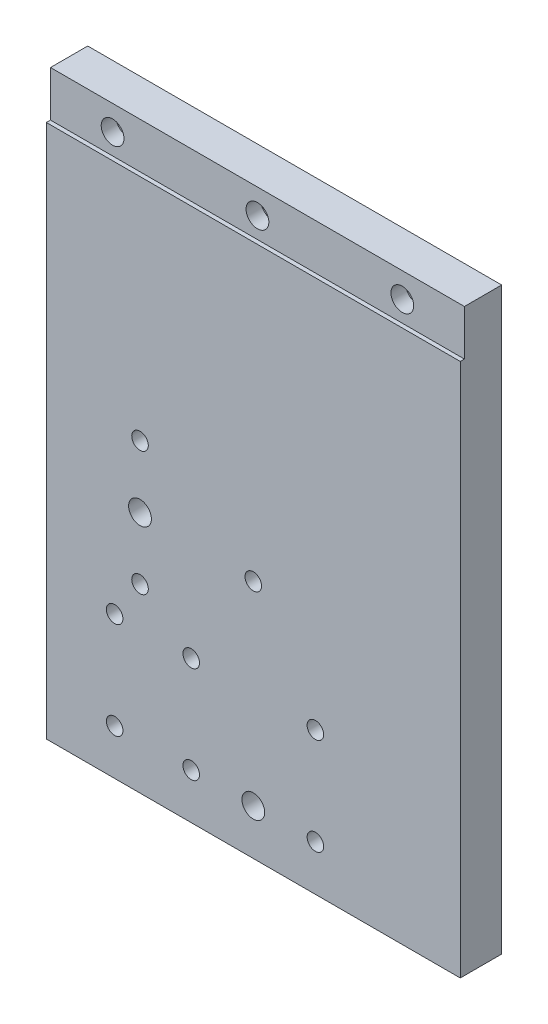
ISO-10303-21;
HEADER;
FILE_DESCRIPTION(('STEP AP214'),'2;1');
FILE_NAME('part.step','',(''),(''),'','','');
FILE_SCHEMA(('AUTOMOTIVE_DESIGN { 1 0 10303 214 1 1 1 1 }'));
ENDSEC;
DATA;
#1=APPLICATION_CONTEXT('core data for automotive mechanical design processes');
#2=APPLICATION_PROTOCOL_DEFINITION('international standard','automotive_design',2000,#1);
#3=PRODUCT_CONTEXT('',#1,'mechanical');
#4=PRODUCT('Part','Part','',(#3));
#5=PRODUCT_RELATED_PRODUCT_CATEGORY('part','',(#4));
#6=PRODUCT_DEFINITION_FORMATION('','',#4);
#7=PRODUCT_DEFINITION_CONTEXT('part definition',#1,'design');
#8=PRODUCT_DEFINITION('design','',#6,#7);
#9=PRODUCT_DEFINITION_SHAPE('','',#8);
#10=(LENGTH_UNIT() NAMED_UNIT(*) SI_UNIT(.MILLI.,.METRE.));
#11=(NAMED_UNIT(*) PLANE_ANGLE_UNIT() SI_UNIT($,.RADIAN.));
#12=(NAMED_UNIT(*) SI_UNIT($,.STERADIAN.) SOLID_ANGLE_UNIT());
#13=UNCERTAINTY_MEASURE_WITH_UNIT(LENGTH_MEASURE(1.E-05),#10,'distance_accuracy_value','');
#14=(GEOMETRIC_REPRESENTATION_CONTEXT(3) GLOBAL_UNCERTAINTY_ASSIGNED_CONTEXT((#13)) GLOBAL_UNIT_ASSIGNED_CONTEXT((#10,
#11,#12)) REPRESENTATION_CONTEXT('',''));
#15=CARTESIAN_POINT('',(0.,0.,0.));
#16=DIRECTION('',(0.,0.,1.));
#17=DIRECTION('',(1.,0.,0.));
#18=AXIS2_PLACEMENT_3D('',#15,#16,#17);
#19=CARTESIAN_POINT('',(-50.,70.,10.));
#20=DIRECTION('',(0.,-1.,0.));
#21=DIRECTION('',(0.,0.,-1.));
#22=AXIS2_PLACEMENT_3D('',#19,#20,#21);
#23=PLANE('',#22);
#24=DIRECTION('',(-1.,0.,0.));
#25=VECTOR('',#24,1.);
#26=CARTESIAN_POINT('',(-50.,70.,9.));
#27=LINE('',#26,#25);
#28=CARTESIAN_POINT('',(50.,70.,9.));
#29=VERTEX_POINT('',#28);
#30=CARTESIAN_POINT('',(-50.,70.,9.));
#31=VERTEX_POINT('',#30);
#32=EDGE_CURVE('E147',#29,#31,#27,.T.);
#33=ORIENTED_EDGE('',*,*,#32,.F.);
#34=DIRECTION('',(0.,0.,-1.));
#35=VECTOR('',#34,1.);
#36=CARTESIAN_POINT('',(50.,70.,10.));
#37=LINE('',#36,#35);
#38=CARTESIAN_POINT('',(50.,70.,0.));
#39=VERTEX_POINT('',#38);
#40=EDGE_CURVE('E11',#29,#39,#37,.T.);
#41=ORIENTED_EDGE('',*,*,#40,.T.);
#42=DIRECTION('',(-1.,0.,0.));
#43=VECTOR('',#42,1.);
#44=CARTESIAN_POINT('',(-50.,70.,0.));
#45=LINE('',#44,#43);
#46=CARTESIAN_POINT('',(-50.,70.,0.));
#47=VERTEX_POINT('',#46);
#48=EDGE_CURVE('E116',#39,#47,#45,.T.);
#49=ORIENTED_EDGE('',*,*,#48,.T.);
#50=DIRECTION('',(0.,0.,-1.));
#51=VECTOR('',#50,1.);
#52=CARTESIAN_POINT('',(-50.,70.,10.));
#53=LINE('',#52,#51);
#54=EDGE_CURVE('E52',#31,#47,#53,.T.);
#55=ORIENTED_EDGE('',*,*,#54,.F.);
#56=EDGE_LOOP('',(#33,#41,#49,#55));
#57=FACE_BOUND('',#56,.T.);
#58=ADVANCED_FACE('F42',(#57),#23,.F.);
#59=CARTESIAN_POINT('',(35.,64.,0.));
#60=DIRECTION('',(0.,0.,-1.));
#61=DIRECTION('',(-1.,0.,0.));
#62=AXIS2_PLACEMENT_3D('',#59,#60,#61);
#63=CYLINDRICAL_SURFACE('',#62,2.75);
#64=CARTESIAN_POINT('',(35.,64.,5.4));
#65=DIRECTION('',(0.,0.,-1.));
#66=DIRECTION('',(-1.,0.,0.));
#67=AXIS2_PLACEMENT_3D('',#64,#65,#66);
#68=CIRCLE('',#67,2.75);
#69=CARTESIAN_POINT('',(32.25,64.,5.4));
#70=VERTEX_POINT('',#69);
#71=EDGE_CURVE('E118',#70,#70,#68,.T.);
#72=ORIENTED_EDGE('',*,*,#71,.T.);
#73=EDGE_LOOP('',(#72));
#74=FACE_BOUND('',#73,.T.);
#75=CARTESIAN_POINT('',(35.,64.,9.));
#76=DIRECTION('',(0.,0.,1.));
#77=DIRECTION('',(1.,0.,0.));
#78=AXIS2_PLACEMENT_3D('',#75,#76,#77);
#79=CIRCLE('',#78,2.75);
#80=CARTESIAN_POINT('',(37.75,64.,9.));
#81=VERTEX_POINT('',#80);
#82=EDGE_CURVE('E186',#81,#81,#79,.F.);
#83=ORIENTED_EDGE('',*,*,#82,.F.);
#84=EDGE_LOOP('',(#83));
#85=FACE_BOUND('',#84,.T.);
#86=ADVANCED_FACE('F350',(#74,#85),#63,.F.);
#87=CARTESIAN_POINT('',(-35.,64.,0.));
#88=DIRECTION('',(0.,0.,-1.));
#89=DIRECTION('',(-1.,0.,0.));
#90=AXIS2_PLACEMENT_3D('',#87,#88,#89);
#91=CYLINDRICAL_SURFACE('',#90,2.75);
#92=CARTESIAN_POINT('',(-35.,64.,5.4));
#93=DIRECTION('',(0.,0.,-1.));
#94=DIRECTION('',(-1.,0.,0.));
#95=AXIS2_PLACEMENT_3D('',#92,#93,#94);
#96=CIRCLE('',#95,2.75);
#97=CARTESIAN_POINT('',(-37.75,64.,5.4));
#98=VERTEX_POINT('',#97);
#99=EDGE_CURVE('E210',#98,#98,#96,.T.);
#100=ORIENTED_EDGE('',*,*,#99,.T.);
#101=EDGE_LOOP('',(#100));
#102=FACE_BOUND('',#101,.T.);
#103=CARTESIAN_POINT('',(-35.,64.,9.));
#104=DIRECTION('',(0.,0.,1.));
#105=DIRECTION('',(1.,0.,0.));
#106=AXIS2_PLACEMENT_3D('',#103,#104,#105);
#107=CIRCLE('',#106,2.75);
#108=CARTESIAN_POINT('',(-32.25,64.,9.));
#109=VERTEX_POINT('',#108);
#110=EDGE_CURVE('E182',#109,#109,#107,.F.);
#111=ORIENTED_EDGE('',*,*,#110,.F.);
#112=EDGE_LOOP('',(#111));
#113=FACE_BOUND('',#112,.T.);
#114=ADVANCED_FACE('F354',(#102,#113),#91,.F.);
#115=CARTESIAN_POINT('',(0.,64.,0.));
#116=DIRECTION('',(0.,0.,-1.));
#117=DIRECTION('',(-1.,0.,0.));
#118=AXIS2_PLACEMENT_3D('',#115,#116,#117);
#119=CYLINDRICAL_SURFACE('',#118,2.75);
#120=CARTESIAN_POINT('',(0.,64.,5.4));
#121=DIRECTION('',(0.,0.,-1.));
#122=DIRECTION('',(-1.,0.,0.));
#123=AXIS2_PLACEMENT_3D('',#120,#121,#122);
#124=CIRCLE('',#123,2.75);
#125=CARTESIAN_POINT('',(-2.75,64.,5.4));
#126=VERTEX_POINT('',#125);
#127=EDGE_CURVE('E198',#126,#126,#124,.T.);
#128=ORIENTED_EDGE('',*,*,#127,.T.);
#129=EDGE_LOOP('',(#128));
#130=FACE_BOUND('',#129,.T.);
#131=CARTESIAN_POINT('',(0.,64.,9.));
#132=DIRECTION('',(0.,0.,1.));
#133=DIRECTION('',(1.,0.,0.));
#134=AXIS2_PLACEMENT_3D('',#131,#132,#133);
#135=CIRCLE('',#134,2.75);
#136=CARTESIAN_POINT('',(2.75,64.,9.));
#137=VERTEX_POINT('',#136);
#138=EDGE_CURVE('E46',#137,#137,#135,.F.);
#139=ORIENTED_EDGE('',*,*,#138,.F.);
#140=EDGE_LOOP('',(#139));
#141=FACE_BOUND('',#140,.T.);
#142=ADVANCED_FACE('F432',(#130,#141),#119,.F.);
#143=CARTESIAN_POINT('',(50.,70.,10.));
#144=DIRECTION('',(-1.,0.,0.));
#145=DIRECTION('',(0.,-1.,0.));
#146=AXIS2_PLACEMENT_3D('',#143,#144,#145);
#147=PLANE('',#146);
#148=DIRECTION('',(0.,1.,0.));
#149=VECTOR('',#148,1.);
#150=CARTESIAN_POINT('',(50.,70.,9.));
#151=LINE('',#150,#149);
#152=CARTESIAN_POINT('',(50.,59.,9.));
#153=VERTEX_POINT('',#152);
#154=EDGE_CURVE('E150',#153,#29,#151,.T.);
#155=ORIENTED_EDGE('',*,*,#154,.F.);
#156=DIRECTION('',(0.,0.,1.));
#157=VECTOR('',#156,1.);
#158=CARTESIAN_POINT('',(50.,59.,9.));
#159=LINE('',#158,#157);
#160=CARTESIAN_POINT('',(50.,59.,10.));
#161=VERTEX_POINT('',#160);
#162=EDGE_CURVE('E166',#153,#161,#159,.T.);
#163=ORIENTED_EDGE('',*,*,#162,.T.);
#164=DIRECTION('',(0.,1.,0.));
#165=VECTOR('',#164,1.);
#166=CARTESIAN_POINT('',(50.,70.,10.));
#167=LINE('',#166,#165);
#168=CARTESIAN_POINT('',(50.,-70.,10.));
#169=VERTEX_POINT('',#168);
#170=EDGE_CURVE('E103',#169,#161,#167,.T.);
#171=ORIENTED_EDGE('',*,*,#170,.F.);
#172=DIRECTION('',(0.,0.,-1.));
#173=VECTOR('',#172,1.);
#174=CARTESIAN_POINT('',(50.,-70.,10.));
#175=LINE('',#174,#173);
#176=CARTESIAN_POINT('',(50.,-70.,0.));
#177=VERTEX_POINT('',#176);
#178=EDGE_CURVE('E95',#169,#177,#175,.T.);
#179=ORIENTED_EDGE('',*,*,#178,.T.);
#180=DIRECTION('',(0.,1.,0.));
#181=VECTOR('',#180,1.);
#182=CARTESIAN_POINT('',(50.,70.,0.));
#183=LINE('',#182,#181);
#184=EDGE_CURVE('E110',#177,#39,#183,.T.);
#185=ORIENTED_EDGE('',*,*,#184,.T.);
#186=ORIENTED_EDGE('',*,*,#40,.F.);
#187=EDGE_LOOP('',(#155,#163,#171,#179,#185,#186));
#188=FACE_BOUND('',#187,.T.);
#189=ADVANCED_FACE('F44',(#188),#147,.F.);
#190=CARTESIAN_POINT('',(-50.,70.,10.));
#191=DIRECTION('',(1.,0.,0.));
#192=DIRECTION('',(0.,1.,0.));
#193=AXIS2_PLACEMENT_3D('',#190,#191,#192);
#194=PLANE('',#193);
#195=DIRECTION('',(0.,-1.,0.));
#196=VECTOR('',#195,1.);
#197=CARTESIAN_POINT('',(-50.,70.,10.));
#198=LINE('',#197,#196);
#199=CARTESIAN_POINT('',(-50.,59.,10.));
#200=VERTEX_POINT('',#199);
#201=CARTESIAN_POINT('',(-50.,-70.,10.));
#202=VERTEX_POINT('',#201);
#203=EDGE_CURVE('E172',#200,#202,#198,.T.);
#204=ORIENTED_EDGE('',*,*,#203,.F.);
#205=DIRECTION('',(0.,0.,1.));
#206=VECTOR('',#205,1.);
#207=CARTESIAN_POINT('',(-50.,59.,9.));
#208=LINE('',#207,#206);
#209=CARTESIAN_POINT('',(-50.,59.,9.));
#210=VERTEX_POINT('',#209);
#211=EDGE_CURVE('E62',#210,#200,#208,.T.);
#212=ORIENTED_EDGE('',*,*,#211,.F.);
#213=DIRECTION('',(0.,-1.,0.));
#214=VECTOR('',#213,1.);
#215=CARTESIAN_POINT('',(-50.,70.,9.));
#216=LINE('',#215,#214);
#217=EDGE_CURVE('E142',#31,#210,#216,.T.);
#218=ORIENTED_EDGE('',*,*,#217,.F.);
#219=ORIENTED_EDGE('',*,*,#54,.T.);
#220=DIRECTION('',(0.,-1.,0.));
#221=VECTOR('',#220,1.);
#222=CARTESIAN_POINT('',(-50.,70.,0.));
#223=LINE('',#222,#221);
#224=CARTESIAN_POINT('',(-50.,-70.,0.));
#225=VERTEX_POINT('',#224);
#226=EDGE_CURVE('E104',#47,#225,#223,.T.);
#227=ORIENTED_EDGE('',*,*,#226,.T.);
#228=DIRECTION('',(0.,0.,-1.));
#229=VECTOR('',#228,1.);
#230=CARTESIAN_POINT('',(-50.,-70.,10.));
#231=LINE('',#230,#229);
#232=EDGE_CURVE('E98',#202,#225,#231,.T.);
#233=ORIENTED_EDGE('',*,*,#232,.F.);
#234=EDGE_LOOP('',(#204,#212,#218,#219,#227,#233));
#235=FACE_BOUND('',#234,.T.);
#236=ADVANCED_FACE('F140',(#235),#194,.F.);
#237=CARTESIAN_POINT('',(-50.,-70.,10.));
#238=DIRECTION('',(0.,1.,0.));
#239=DIRECTION('',(-1.,0.,0.));
#240=AXIS2_PLACEMENT_3D('',#237,#238,#239);
#241=PLANE('',#240);
#242=DIRECTION('',(1.,0.,0.));
#243=VECTOR('',#242,1.);
#244=CARTESIAN_POINT('',(-50.,-70.,0.));
#245=LINE('',#244,#243);
#246=EDGE_CURVE('E92',#225,#177,#245,.T.);
#247=ORIENTED_EDGE('',*,*,#246,.T.);
#248=ORIENTED_EDGE('',*,*,#178,.F.);
#249=DIRECTION('',(1.,0.,0.));
#250=VECTOR('',#249,1.);
#251=CARTESIAN_POINT('',(-50.,-70.,10.));
#252=LINE('',#251,#250);
#253=EDGE_CURVE('E71',#202,#169,#252,.T.);
#254=ORIENTED_EDGE('',*,*,#253,.F.);
#255=ORIENTED_EDGE('',*,*,#232,.T.);
#256=EDGE_LOOP('',(#247,#248,#254,#255));
#257=FACE_BOUND('',#256,.T.);
#258=ADVANCED_FACE('F94',(#257),#241,.F.);
#259=CARTESIAN_POINT('',(0.,0.,10.));
#260=DIRECTION('',(0.,0.,1.));
#261=DIRECTION('',(1.,0.,0.));
#262=AXIS2_PLACEMENT_3D('',#259,#260,#261);
#263=PLANE('',#262);
#264=CARTESIAN_POINT('',(0.,-12.,10.));
#265=DIRECTION('',(0.,0.,1.));
#266=DIRECTION('',(1.,0.,0.));
#267=AXIS2_PLACEMENT_3D('',#264,#265,#266);
#268=CIRCLE('',#267,1.99999999999999);
#269=CARTESIAN_POINT('',(1.99999999999999,-12.,10.));
#270=VERTEX_POINT('',#269);
#271=EDGE_CURVE('E369',#270,#270,#268,.T.);
#272=ORIENTED_EDGE('',*,*,#271,.F.);
#273=EDGE_LOOP('',(#272));
#274=FACE_BOUND('',#273,.T.);
#275=CARTESIAN_POINT('',(-33.5,-35.6,10.));
#276=DIRECTION('',(0.,0.,1.));
#277=DIRECTION('',(1.,0.,0.));
#278=AXIS2_PLACEMENT_3D('',#275,#276,#277);
#279=CIRCLE('',#278,2.);
#280=CARTESIAN_POINT('',(-31.5,-35.6,10.));
#281=VERTEX_POINT('',#280);
#282=EDGE_CURVE('E373',#281,#281,#279,.T.);
#283=ORIENTED_EDGE('',*,*,#282,.F.);
#284=EDGE_LOOP('',(#283));
#285=FACE_BOUND('',#284,.T.);
#286=CARTESIAN_POINT('',(-33.5,-59.,10.));
#287=DIRECTION('',(0.,0.,1.));
#288=DIRECTION('',(1.,0.,0.));
#289=AXIS2_PLACEMENT_3D('',#286,#287,#288);
#290=CIRCLE('',#289,2.);
#291=CARTESIAN_POINT('',(-31.5,-59.,10.));
#292=VERTEX_POINT('',#291);
#293=EDGE_CURVE('E377',#292,#292,#290,.T.);
#294=ORIENTED_EDGE('',*,*,#293,.F.);
#295=EDGE_LOOP('',(#294));
#296=FACE_BOUND('',#295,.T.);
#297=CARTESIAN_POINT('',(-15.,-35.6,9.99999999999999));
#298=DIRECTION('',(0.,0.,-1.));
#299=DIRECTION('',(-1.,0.,0.));
#300=AXIS2_PLACEMENT_3D('',#297,#298,#299);
#301=CIRCLE('',#300,1.99999999999999);
#302=CARTESIAN_POINT('',(-17.,-35.6,9.99999999999999));
#303=VERTEX_POINT('',#302);
#304=EDGE_CURVE('E381',#303,#303,#301,.T.);
#305=ORIENTED_EDGE('',*,*,#304,.T.);
#306=EDGE_LOOP('',(#305));
#307=FACE_BOUND('',#306,.T.);
#308=CARTESIAN_POINT('',(15.,-35.6,9.99999999999999));
#309=DIRECTION('',(0.,0.,-1.));
#310=DIRECTION('',(-1.,0.,0.));
#311=AXIS2_PLACEMENT_3D('',#308,#309,#310);
#312=CIRCLE('',#311,1.99999999999999);
#313=CARTESIAN_POINT('',(13.,-35.6,9.99999999999999));
#314=VERTEX_POINT('',#313);
#315=EDGE_CURVE('E258',#314,#314,#312,.T.);
#316=ORIENTED_EDGE('',*,*,#315,.T.);
#317=EDGE_LOOP('',(#316));
#318=FACE_BOUND('',#317,.T.);
#319=CARTESIAN_POINT('',(-15.,-59.,10.));
#320=DIRECTION('',(0.,0.,-1.));
#321=DIRECTION('',(-1.,0.,0.));
#322=AXIS2_PLACEMENT_3D('',#319,#320,#321);
#323=CIRCLE('',#322,2.);
#324=CARTESIAN_POINT('',(-17.,-59.,10.));
#325=VERTEX_POINT('',#324);
#326=EDGE_CURVE('E233',#325,#325,#323,.T.);
#327=ORIENTED_EDGE('',*,*,#326,.T.);
#328=EDGE_LOOP('',(#327));
#329=FACE_BOUND('',#328,.T.);
#330=CARTESIAN_POINT('',(15.,-59.,10.));
#331=DIRECTION('',(0.,0.,-1.));
#332=DIRECTION('',(-1.,0.,0.));
#333=AXIS2_PLACEMENT_3D('',#330,#331,#332);
#334=CIRCLE('',#333,2.);
#335=CARTESIAN_POINT('',(13.,-59.,10.));
#336=VERTEX_POINT('',#335);
#337=EDGE_CURVE('E225',#336,#336,#334,.T.);
#338=ORIENTED_EDGE('',*,*,#337,.T.);
#339=EDGE_LOOP('',(#338));
#340=FACE_BOUND('',#339,.T.);
#341=CARTESIAN_POINT('',(-27.37,-26.28,10.));
#342=DIRECTION('',(0.,0.,-1.));
#343=DIRECTION('',(-1.,0.,0.));
#344=AXIS2_PLACEMENT_3D('',#341,#342,#343);
#345=CIRCLE('',#344,2.);
#346=CARTESIAN_POINT('',(-29.37,-26.28,10.));
#347=VERTEX_POINT('',#346);
#348=EDGE_CURVE('E271',#347,#347,#345,.T.);
#349=ORIENTED_EDGE('',*,*,#348,.T.);
#350=EDGE_LOOP('',(#349));
#351=FACE_BOUND('',#350,.T.);
#352=CARTESIAN_POINT('',(-27.37,3.72,10.));
#353=DIRECTION('',(0.,0.,-1.));
#354=DIRECTION('',(-1.,0.,0.));
#355=AXIS2_PLACEMENT_3D('',#352,#353,#354);
#356=CIRCLE('',#355,2.);
#357=CARTESIAN_POINT('',(-29.37,3.72,10.));
#358=VERTEX_POINT('',#357);
#359=EDGE_CURVE('E251',#358,#358,#356,.T.);
#360=ORIENTED_EDGE('',*,*,#359,.T.);
#361=EDGE_LOOP('',(#360));
#362=FACE_BOUND('',#361,.T.);
#363=CARTESIAN_POINT('',(0.,-59.,10.));
#364=DIRECTION('',(0.,0.,-1.));
#365=DIRECTION('',(-1.,0.,0.));
#366=AXIS2_PLACEMENT_3D('',#363,#364,#365);
#367=CIRCLE('',#366,2.75);
#368=CARTESIAN_POINT('',(-2.75,-59.,10.));
#369=VERTEX_POINT('',#368);
#370=EDGE_CURVE('E235',#369,#369,#367,.T.);
#371=ORIENTED_EDGE('',*,*,#370,.T.);
#372=EDGE_LOOP('',(#371));
#373=FACE_BOUND('',#372,.T.);
#374=CARTESIAN_POINT('',(-27.37,-11.28,10.));
#375=DIRECTION('',(0.,0.,-1.));
#376=DIRECTION('',(-1.,0.,0.));
#377=AXIS2_PLACEMENT_3D('',#374,#375,#376);
#378=CIRCLE('',#377,2.75);
#379=CARTESIAN_POINT('',(-30.12,-11.28,10.));
#380=VERTEX_POINT('',#379);
#381=EDGE_CURVE('E292',#380,#380,#378,.T.);
#382=ORIENTED_EDGE('',*,*,#381,.T.);
#383=EDGE_LOOP('',(#382));
#384=FACE_BOUND('',#383,.T.);
#385=DIRECTION('',(1.,0.,0.));
#386=VECTOR('',#385,1.);
#387=CARTESIAN_POINT('',(-50.,59.,10.));
#388=LINE('',#387,#386);
#389=EDGE_CURVE('E163',#200,#161,#388,.T.);
#390=ORIENTED_EDGE('',*,*,#389,.F.);
#391=ORIENTED_EDGE('',*,*,#203,.T.);
#392=ORIENTED_EDGE('',*,*,#253,.T.);
#393=ORIENTED_EDGE('',*,*,#170,.T.);
#394=EDGE_LOOP('',(#390,#391,#392,#393));
#395=FACE_BOUND('',#394,.T.);
#396=ADVANCED_FACE('F301',(#274,#285,#296,#307,#318,#329,#340,#351,#362,#373,#384,#395),#263,.T.);
#397=CARTESIAN_POINT('',(0.,0.,0.));
#398=DIRECTION('',(0.,0.,1.));
#399=DIRECTION('',(1.,0.,0.));
#400=AXIS2_PLACEMENT_3D('',#397,#398,#399);
#401=PLANE('',#400);
#402=CARTESIAN_POINT('',(0.,-12.,0.));
#403=DIRECTION('',(0.,0.,1.));
#404=DIRECTION('',(1.,0.,0.));
#405=AXIS2_PLACEMENT_3D('',#402,#403,#404);
#406=CIRCLE('',#405,1.99999999999999);
#407=CARTESIAN_POINT('',(1.99999999999999,-12.,0.));
#408=VERTEX_POINT('',#407);
#409=EDGE_CURVE('E658',#408,#408,#406,.T.);
#410=ORIENTED_EDGE('',*,*,#409,.T.);
#411=EDGE_LOOP('',(#410));
#412=FACE_BOUND('',#411,.T.);
#413=CARTESIAN_POINT('',(-33.5,-35.6,0.));
#414=DIRECTION('',(0.,0.,1.));
#415=DIRECTION('',(1.,0.,0.));
#416=AXIS2_PLACEMENT_3D('',#413,#414,#415);
#417=CIRCLE('',#416,1.99999999999999);
#418=CARTESIAN_POINT('',(-31.5,-35.6,0.));
#419=VERTEX_POINT('',#418);
#420=EDGE_CURVE('E665',#419,#419,#417,.T.);
#421=ORIENTED_EDGE('',*,*,#420,.T.);
#422=EDGE_LOOP('',(#421));
#423=FACE_BOUND('',#422,.T.);
#424=CARTESIAN_POINT('',(-33.5,-59.,0.));
#425=DIRECTION('',(0.,0.,1.));
#426=DIRECTION('',(1.,0.,0.));
#427=AXIS2_PLACEMENT_3D('',#424,#425,#426);
#428=CIRCLE('',#427,1.99999999999999);
#429=CARTESIAN_POINT('',(-31.5,-59.,0.));
#430=VERTEX_POINT('',#429);
#431=EDGE_CURVE('E670',#430,#430,#428,.T.);
#432=ORIENTED_EDGE('',*,*,#431,.T.);
#433=EDGE_LOOP('',(#432));
#434=FACE_BOUND('',#433,.T.);
#435=CARTESIAN_POINT('',(-15.,-35.6,0.));
#436=DIRECTION('',(0.,0.,-1.));
#437=DIRECTION('',(-1.,0.,0.));
#438=AXIS2_PLACEMENT_3D('',#435,#436,#437);
#439=CIRCLE('',#438,1.99999999999999);
#440=CARTESIAN_POINT('',(-17.,-35.6,0.));
#441=VERTEX_POINT('',#440);
#442=EDGE_CURVE('E673',#441,#441,#439,.T.);
#443=ORIENTED_EDGE('',*,*,#442,.F.);
#444=EDGE_LOOP('',(#443));
#445=FACE_BOUND('',#444,.T.);
#446=CARTESIAN_POINT('',(15.,-35.6,0.));
#447=DIRECTION('',(0.,0.,-1.));
#448=DIRECTION('',(-1.,0.,0.));
#449=AXIS2_PLACEMENT_3D('',#446,#447,#448);
#450=CIRCLE('',#449,1.99999999999999);
#451=CARTESIAN_POINT('',(13.,-35.6,0.));
#452=VERTEX_POINT('',#451);
#453=EDGE_CURVE('E264',#452,#452,#450,.T.);
#454=ORIENTED_EDGE('',*,*,#453,.F.);
#455=EDGE_LOOP('',(#454));
#456=FACE_BOUND('',#455,.T.);
#457=CARTESIAN_POINT('',(-15.,-59.,0.));
#458=DIRECTION('',(0.,0.,-1.));
#459=DIRECTION('',(-1.,0.,0.));
#460=AXIS2_PLACEMENT_3D('',#457,#458,#459);
#461=CIRCLE('',#460,2.);
#462=CARTESIAN_POINT('',(-17.,-59.,0.));
#463=VERTEX_POINT('',#462);
#464=EDGE_CURVE('E255',#463,#463,#461,.T.);
#465=ORIENTED_EDGE('',*,*,#464,.F.);
#466=EDGE_LOOP('',(#465));
#467=FACE_BOUND('',#466,.T.);
#468=CARTESIAN_POINT('',(15.,-59.,0.));
#469=DIRECTION('',(0.,0.,-1.));
#470=DIRECTION('',(-1.,0.,0.));
#471=AXIS2_PLACEMENT_3D('',#468,#469,#470);
#472=CIRCLE('',#471,2.);
#473=CARTESIAN_POINT('',(13.,-59.,0.));
#474=VERTEX_POINT('',#473);
#475=EDGE_CURVE('E229',#474,#474,#472,.T.);
#476=ORIENTED_EDGE('',*,*,#475,.F.);
#477=EDGE_LOOP('',(#476));
#478=FACE_BOUND('',#477,.T.);
#479=CARTESIAN_POINT('',(-27.37,-26.28,0.));
#480=DIRECTION('',(0.,0.,-1.));
#481=DIRECTION('',(-1.,0.,0.));
#482=AXIS2_PLACEMENT_3D('',#479,#480,#481);
#483=CIRCLE('',#482,2.);
#484=CARTESIAN_POINT('',(-29.37,-26.28,0.));
#485=VERTEX_POINT('',#484);
#486=EDGE_CURVE('E228',#485,#485,#483,.T.);
#487=ORIENTED_EDGE('',*,*,#486,.F.);
#488=EDGE_LOOP('',(#487));
#489=FACE_BOUND('',#488,.T.);
#490=CARTESIAN_POINT('',(-27.37,3.72,0.));
#491=DIRECTION('',(0.,0.,-1.));
#492=DIRECTION('',(-1.,0.,0.));
#493=AXIS2_PLACEMENT_3D('',#490,#491,#492);
#494=CIRCLE('',#493,2.);
#495=CARTESIAN_POINT('',(-29.37,3.72,0.));
#496=VERTEX_POINT('',#495);
#497=EDGE_CURVE('E275',#496,#496,#494,.T.);
#498=ORIENTED_EDGE('',*,*,#497,.F.);
#499=EDGE_LOOP('',(#498));
#500=FACE_BOUND('',#499,.T.);
#501=CARTESIAN_POINT('',(0.,-59.,0.));
#502=DIRECTION('',(0.,0.,-1.));
#503=DIRECTION('',(-1.,0.,0.));
#504=AXIS2_PLACEMENT_3D('',#501,#502,#503);
#505=CIRCLE('',#504,5.);
#506=CARTESIAN_POINT('',(-5.,-59.,0.));
#507=VERTEX_POINT('',#506);
#508=EDGE_CURVE('E247',#507,#507,#505,.T.);
#509=ORIENTED_EDGE('',*,*,#508,.F.);
#510=EDGE_LOOP('',(#509));
#511=FACE_BOUND('',#510,.T.);
#512=CARTESIAN_POINT('',(-27.37,-11.28,0.));
#513=DIRECTION('',(0.,0.,-1.));
#514=DIRECTION('',(-1.,0.,0.));
#515=AXIS2_PLACEMENT_3D('',#512,#513,#514);
#516=CIRCLE('',#515,5.);
#517=CARTESIAN_POINT('',(-32.37,-11.28,0.));
#518=VERTEX_POINT('',#517);
#519=EDGE_CURVE('E238',#518,#518,#516,.T.);
#520=ORIENTED_EDGE('',*,*,#519,.F.);
#521=EDGE_LOOP('',(#520));
#522=FACE_BOUND('',#521,.T.);
#523=CARTESIAN_POINT('',(0.,64.,0.));
#524=DIRECTION('',(0.,0.,-1.));
#525=DIRECTION('',(-1.,0.,0.));
#526=AXIS2_PLACEMENT_3D('',#523,#524,#525);
#527=CIRCLE('',#526,5.);
#528=CARTESIAN_POINT('',(-5.,64.,0.));
#529=VERTEX_POINT('',#528);
#530=EDGE_CURVE('E190',#529,#529,#527,.T.);
#531=ORIENTED_EDGE('',*,*,#530,.F.);
#532=EDGE_LOOP('',(#531));
#533=FACE_BOUND('',#532,.T.);
#534=CARTESIAN_POINT('',(-35.,64.,0.));
#535=DIRECTION('',(0.,0.,-1.));
#536=DIRECTION('',(-1.,0.,0.));
#537=AXIS2_PLACEMENT_3D('',#534,#535,#536);
#538=CIRCLE('',#537,5.);
#539=CARTESIAN_POINT('',(-40.,64.,0.));
#540=VERTEX_POINT('',#539);
#541=EDGE_CURVE('E202',#540,#540,#538,.T.);
#542=ORIENTED_EDGE('',*,*,#541,.F.);
#543=EDGE_LOOP('',(#542));
#544=FACE_BOUND('',#543,.T.);
#545=CARTESIAN_POINT('',(35.,64.,0.));
#546=DIRECTION('',(0.,0.,-1.));
#547=DIRECTION('',(-1.,0.,0.));
#548=AXIS2_PLACEMENT_3D('',#545,#546,#547);
#549=CIRCLE('',#548,5.);
#550=CARTESIAN_POINT('',(30.,64.,0.));
#551=VERTEX_POINT('',#550);
#552=EDGE_CURVE('E214',#551,#551,#549,.T.);
#553=ORIENTED_EDGE('',*,*,#552,.F.);
#554=EDGE_LOOP('',(#553));
#555=FACE_BOUND('',#554,.T.);
#556=ORIENTED_EDGE('',*,*,#184,.F.);
#557=ORIENTED_EDGE('',*,*,#246,.F.);
#558=ORIENTED_EDGE('',*,*,#226,.F.);
#559=ORIENTED_EDGE('',*,*,#48,.F.);
#560=EDGE_LOOP('',(#556,#557,#558,#559));
#561=FACE_BOUND('',#560,.T.);
#562=ADVANCED_FACE('F114',(#412,#423,#434,#445,#456,#467,#478,#489,#500,#511,#522,#533,#544,
#555,#561),#401,.F.);
#563=CARTESIAN_POINT('',(37.75,64.,5.4));
#564=DIRECTION('',(0.,0.,1.));
#565=DIRECTION('',(1.,0.,0.));
#566=AXIS2_PLACEMENT_3D('',#563,#564,#565);
#567=PLANE('',#566);
#568=ORIENTED_EDGE('',*,*,#71,.F.);
#569=EDGE_LOOP('',(#568));
#570=FACE_BOUND('',#569,.T.);
#571=CARTESIAN_POINT('',(35.,64.,5.4));
#572=DIRECTION('',(0.,0.,-1.));
#573=DIRECTION('',(-1.,0.,0.));
#574=AXIS2_PLACEMENT_3D('',#571,#572,#573);
#575=CIRCLE('',#574,5.);
#576=CARTESIAN_POINT('',(30.,64.,5.4));
#577=VERTEX_POINT('',#576);
#578=EDGE_CURVE('E126',#577,#577,#575,.T.);
#579=ORIENTED_EDGE('',*,*,#578,.T.);
#580=EDGE_LOOP('',(#579));
#581=FACE_BOUND('',#580,.T.);
#582=ADVANCED_FACE('F324',(#570,#581),#567,.F.);
#583=CARTESIAN_POINT('',(35.,64.,0.));
#584=DIRECTION('',(0.,0.,-1.));
#585=DIRECTION('',(-1.,0.,0.));
#586=AXIS2_PLACEMENT_3D('',#583,#584,#585);
#587=CYLINDRICAL_SURFACE('',#586,5.);
#588=ORIENTED_EDGE('',*,*,#578,.F.);
#589=EDGE_LOOP('',(#588));
#590=FACE_BOUND('',#589,.T.);
#591=ORIENTED_EDGE('',*,*,#552,.T.);
#592=EDGE_LOOP('',(#591));
#593=FACE_BOUND('',#592,.T.);
#594=ADVANCED_FACE('F333',(#590,#593),#587,.F.);
#595=CARTESIAN_POINT('',(-32.25,64.,5.4));
#596=DIRECTION('',(0.,0.,1.));
#597=DIRECTION('',(1.,0.,0.));
#598=AXIS2_PLACEMENT_3D('',#595,#596,#597);
#599=PLANE('',#598);
#600=ORIENTED_EDGE('',*,*,#99,.F.);
#601=EDGE_LOOP('',(#600));
#602=FACE_BOUND('',#601,.T.);
#603=CARTESIAN_POINT('',(-35.,64.,5.4));
#604=DIRECTION('',(0.,0.,-1.));
#605=DIRECTION('',(-1.,0.,0.));
#606=AXIS2_PLACEMENT_3D('',#603,#604,#605);
#607=CIRCLE('',#606,5.);
#608=CARTESIAN_POINT('',(-40.,64.,5.4));
#609=VERTEX_POINT('',#608);
#610=EDGE_CURVE('E206',#609,#609,#607,.T.);
#611=ORIENTED_EDGE('',*,*,#610,.T.);
#612=EDGE_LOOP('',(#611));
#613=FACE_BOUND('',#612,.T.);
#614=ADVANCED_FACE('F335',(#602,#613),#599,.F.);
#615=CARTESIAN_POINT('',(-35.,64.,0.));
#616=DIRECTION('',(0.,0.,-1.));
#617=DIRECTION('',(-1.,0.,0.));
#618=AXIS2_PLACEMENT_3D('',#615,#616,#617);
#619=CYLINDRICAL_SURFACE('',#618,5.);
#620=ORIENTED_EDGE('',*,*,#610,.F.);
#621=EDGE_LOOP('',(#620));
#622=FACE_BOUND('',#621,.T.);
#623=ORIENTED_EDGE('',*,*,#541,.T.);
#624=EDGE_LOOP('',(#623));
#625=FACE_BOUND('',#624,.T.);
#626=ADVANCED_FACE('F342',(#622,#625),#619,.F.);
#627=CARTESIAN_POINT('',(2.75,64.,5.4));
#628=DIRECTION('',(0.,0.,1.));
#629=DIRECTION('',(1.,0.,0.));
#630=AXIS2_PLACEMENT_3D('',#627,#628,#629);
#631=PLANE('',#630);
#632=ORIENTED_EDGE('',*,*,#127,.F.);
#633=EDGE_LOOP('',(#632));
#634=FACE_BOUND('',#633,.T.);
#635=CARTESIAN_POINT('',(0.,64.,5.4));
#636=DIRECTION('',(0.,0.,-1.));
#637=DIRECTION('',(-1.,0.,0.));
#638=AXIS2_PLACEMENT_3D('',#635,#636,#637);
#639=CIRCLE('',#638,5.);
#640=CARTESIAN_POINT('',(-5.,64.,5.4));
#641=VERTEX_POINT('',#640);
#642=EDGE_CURVE('E194',#641,#641,#639,.T.);
#643=ORIENTED_EDGE('',*,*,#642,.T.);
#644=EDGE_LOOP('',(#643));
#645=FACE_BOUND('',#644,.T.);
#646=ADVANCED_FACE('F427',(#634,#645),#631,.F.);
#647=CARTESIAN_POINT('',(0.,64.,0.));
#648=DIRECTION('',(0.,0.,-1.));
#649=DIRECTION('',(-1.,0.,0.));
#650=AXIS2_PLACEMENT_3D('',#647,#648,#649);
#651=CYLINDRICAL_SURFACE('',#650,5.);
#652=ORIENTED_EDGE('',*,*,#642,.F.);
#653=EDGE_LOOP('',(#652));
#654=FACE_BOUND('',#653,.T.);
#655=ORIENTED_EDGE('',*,*,#530,.T.);
#656=EDGE_LOOP('',(#655));
#657=FACE_BOUND('',#656,.T.);
#658=ADVANCED_FACE('F422',(#654,#657),#651,.F.);
#659=CARTESIAN_POINT('',(0.,0.,9.));
#660=DIRECTION('',(0.,0.,1.));
#661=DIRECTION('',(1.,0.,0.));
#662=AXIS2_PLACEMENT_3D('',#659,#660,#661);
#663=PLANE('',#662);
#664=ORIENTED_EDGE('',*,*,#217,.T.);
#665=DIRECTION('',(1.,0.,0.));
#666=VECTOR('',#665,1.);
#667=CARTESIAN_POINT('',(-50.,59.,9.));
#668=LINE('',#667,#666);
#669=EDGE_CURVE('E164',#210,#153,#668,.T.);
#670=ORIENTED_EDGE('',*,*,#669,.T.);
#671=ORIENTED_EDGE('',*,*,#154,.T.);
#672=ORIENTED_EDGE('',*,*,#32,.T.);
#673=EDGE_LOOP('',(#664,#670,#671,#672));
#674=FACE_BOUND('',#673,.T.);
#675=ORIENTED_EDGE('',*,*,#138,.T.);
#676=EDGE_LOOP('',(#675));
#677=FACE_BOUND('',#676,.T.);
#678=ORIENTED_EDGE('',*,*,#110,.T.);
#679=EDGE_LOOP('',(#678));
#680=FACE_BOUND('',#679,.T.);
#681=ORIENTED_EDGE('',*,*,#82,.T.);
#682=EDGE_LOOP('',(#681));
#683=FACE_BOUND('',#682,.T.);
#684=ADVANCED_FACE('F168',(#674,#677,#680,#683),#663,.T.);
#685=CARTESIAN_POINT('',(-50.,59.,9.));
#686=DIRECTION('',(0.,-1.,0.));
#687=DIRECTION('',(1.,0.,0.));
#688=AXIS2_PLACEMENT_3D('',#685,#686,#687);
#689=PLANE('',#688);
#690=ORIENTED_EDGE('',*,*,#389,.T.);
#691=ORIENTED_EDGE('',*,*,#162,.F.);
#692=ORIENTED_EDGE('',*,*,#669,.F.);
#693=ORIENTED_EDGE('',*,*,#211,.T.);
#694=EDGE_LOOP('',(#690,#691,#692,#693));
#695=FACE_BOUND('',#694,.T.);
#696=ADVANCED_FACE('F165',(#695),#689,.F.);
#697=CARTESIAN_POINT('',(-27.37,-11.28,0.));
#698=DIRECTION('',(0.,0.,-1.));
#699=DIRECTION('',(-1.,0.,0.));
#700=AXIS2_PLACEMENT_3D('',#697,#698,#699);
#701=CYLINDRICAL_SURFACE('',#700,2.75);
#702=ORIENTED_EDGE('',*,*,#381,.F.);
#703=EDGE_LOOP('',(#702));
#704=FACE_BOUND('',#703,.T.);
#705=CARTESIAN_POINT('',(-27.37,-11.28,5.4));
#706=DIRECTION('',(0.,0.,-1.));
#707=DIRECTION('',(-1.,0.,0.));
#708=AXIS2_PLACEMENT_3D('',#705,#706,#707);
#709=CIRCLE('',#708,2.75);
#710=CARTESIAN_POINT('',(-30.12,-11.28,5.4));
#711=VERTEX_POINT('',#710);
#712=EDGE_CURVE('E288',#711,#711,#709,.T.);
#713=ORIENTED_EDGE('',*,*,#712,.T.);
#714=EDGE_LOOP('',(#713));
#715=FACE_BOUND('',#714,.T.);
#716=ADVANCED_FACE('F303',(#704,#715),#701,.F.);
#717=CARTESIAN_POINT('',(-24.62,-11.28,5.4));
#718=DIRECTION('',(0.,0.,1.));
#719=DIRECTION('',(1.,0.,0.));
#720=AXIS2_PLACEMENT_3D('',#717,#718,#719);
#721=PLANE('',#720);
#722=ORIENTED_EDGE('',*,*,#712,.F.);
#723=EDGE_LOOP('',(#722));
#724=FACE_BOUND('',#723,.T.);
#725=CARTESIAN_POINT('',(-27.37,-11.28,5.4));
#726=DIRECTION('',(0.,0.,-1.));
#727=DIRECTION('',(-1.,0.,0.));
#728=AXIS2_PLACEMENT_3D('',#725,#726,#727);
#729=CIRCLE('',#728,5.);
#730=CARTESIAN_POINT('',(-32.37,-11.28,5.4));
#731=VERTEX_POINT('',#730);
#732=EDGE_CURVE('E284',#731,#731,#729,.T.);
#733=ORIENTED_EDGE('',*,*,#732,.T.);
#734=EDGE_LOOP('',(#733));
#735=FACE_BOUND('',#734,.T.);
#736=ADVANCED_FACE('F306',(#724,#735),#721,.F.);
#737=CARTESIAN_POINT('',(-27.37,-11.28,0.));
#738=DIRECTION('',(0.,0.,-1.));
#739=DIRECTION('',(-1.,0.,0.));
#740=AXIS2_PLACEMENT_3D('',#737,#738,#739);
#741=CYLINDRICAL_SURFACE('',#740,5.);
#742=ORIENTED_EDGE('',*,*,#732,.F.);
#743=EDGE_LOOP('',(#742));
#744=FACE_BOUND('',#743,.T.);
#745=ORIENTED_EDGE('',*,*,#519,.T.);
#746=EDGE_LOOP('',(#745));
#747=FACE_BOUND('',#746,.T.);
#748=ADVANCED_FACE('F312',(#744,#747),#741,.F.);
#749=CARTESIAN_POINT('',(0.,-59.,0.));
#750=DIRECTION('',(0.,0.,-1.));
#751=DIRECTION('',(-1.,0.,0.));
#752=AXIS2_PLACEMENT_3D('',#749,#750,#751);
#753=CYLINDRICAL_SURFACE('',#752,2.75);
#754=ORIENTED_EDGE('',*,*,#370,.F.);
#755=EDGE_LOOP('',(#754));
#756=FACE_BOUND('',#755,.T.);
#757=CARTESIAN_POINT('',(0.,-59.,5.4));
#758=DIRECTION('',(0.,0.,-1.));
#759=DIRECTION('',(-1.,0.,0.));
#760=AXIS2_PLACEMENT_3D('',#757,#758,#759);
#761=CIRCLE('',#760,2.75);
#762=CARTESIAN_POINT('',(-2.75,-59.,5.4));
#763=VERTEX_POINT('',#762);
#764=EDGE_CURVE('E239',#763,#763,#761,.T.);
#765=ORIENTED_EDGE('',*,*,#764,.T.);
#766=EDGE_LOOP('',(#765));
#767=FACE_BOUND('',#766,.T.);
#768=ADVANCED_FACE('F318',(#756,#767),#753,.F.);
#769=CARTESIAN_POINT('',(2.75,-59.,5.4));
#770=DIRECTION('',(0.,0.,1.));
#771=DIRECTION('',(1.,0.,0.));
#772=AXIS2_PLACEMENT_3D('',#769,#770,#771);
#773=PLANE('',#772);
#774=ORIENTED_EDGE('',*,*,#764,.F.);
#775=EDGE_LOOP('',(#774));
#776=FACE_BOUND('',#775,.T.);
#777=CARTESIAN_POINT('',(0.,-59.,5.4));
#778=DIRECTION('',(0.,0.,-1.));
#779=DIRECTION('',(-1.,0.,0.));
#780=AXIS2_PLACEMENT_3D('',#777,#778,#779);
#781=CIRCLE('',#780,5.);
#782=CARTESIAN_POINT('',(-5.,-59.,5.4));
#783=VERTEX_POINT('',#782);
#784=EDGE_CURVE('E243',#783,#783,#781,.T.);
#785=ORIENTED_EDGE('',*,*,#784,.T.);
#786=EDGE_LOOP('',(#785));
#787=FACE_BOUND('',#786,.T.);
#788=ADVANCED_FACE('F396',(#776,#787),#773,.F.);
#789=CARTESIAN_POINT('',(0.,-59.,0.));
#790=DIRECTION('',(0.,0.,-1.));
#791=DIRECTION('',(-1.,0.,0.));
#792=AXIS2_PLACEMENT_3D('',#789,#790,#791);
#793=CYLINDRICAL_SURFACE('',#792,5.);
#794=ORIENTED_EDGE('',*,*,#784,.F.);
#795=EDGE_LOOP('',(#794));
#796=FACE_BOUND('',#795,.T.);
#797=ORIENTED_EDGE('',*,*,#508,.T.);
#798=EDGE_LOOP('',(#797));
#799=FACE_BOUND('',#798,.T.);
#800=ADVANCED_FACE('F402',(#796,#799),#793,.F.);
#801=CARTESIAN_POINT('',(-27.37,3.72,0.));
#802=DIRECTION('',(0.,0.,-1.));
#803=DIRECTION('',(-1.,0.,0.));
#804=AXIS2_PLACEMENT_3D('',#801,#802,#803);
#805=CYLINDRICAL_SURFACE('',#804,2.);
#806=ORIENTED_EDGE('',*,*,#359,.F.);
#807=EDGE_LOOP('',(#806));
#808=FACE_BOUND('',#807,.T.);
#809=ORIENTED_EDGE('',*,*,#497,.T.);
#810=EDGE_LOOP('',(#809));
#811=FACE_BOUND('',#810,.T.);
#812=ADVANCED_FACE('F408',(#808,#811),#805,.F.);
#813=CARTESIAN_POINT('',(-27.37,-26.28,0.));
#814=DIRECTION('',(0.,0.,-1.));
#815=DIRECTION('',(-1.,0.,0.));
#816=AXIS2_PLACEMENT_3D('',#813,#814,#815);
#817=CYLINDRICAL_SURFACE('',#816,2.);
#818=ORIENTED_EDGE('',*,*,#348,.F.);
#819=EDGE_LOOP('',(#818));
#820=FACE_BOUND('',#819,.T.);
#821=ORIENTED_EDGE('',*,*,#486,.T.);
#822=EDGE_LOOP('',(#821));
#823=FACE_BOUND('',#822,.T.);
#824=ADVANCED_FACE('F415',(#820,#823),#817,.F.);
#825=CARTESIAN_POINT('',(15.,-59.,0.));
#826=DIRECTION('',(0.,0.,-1.));
#827=DIRECTION('',(-1.,0.,0.));
#828=AXIS2_PLACEMENT_3D('',#825,#826,#827);
#829=CYLINDRICAL_SURFACE('',#828,2.);
#830=ORIENTED_EDGE('',*,*,#337,.F.);
#831=EDGE_LOOP('',(#830));
#832=FACE_BOUND('',#831,.T.);
#833=ORIENTED_EDGE('',*,*,#475,.T.);
#834=EDGE_LOOP('',(#833));
#835=FACE_BOUND('',#834,.T.);
#836=ADVANCED_FACE('F573',(#832,#835),#829,.F.);
#837=CARTESIAN_POINT('',(-15.,-59.,0.));
#838=DIRECTION('',(0.,0.,-1.));
#839=DIRECTION('',(-1.,0.,0.));
#840=AXIS2_PLACEMENT_3D('',#837,#838,#839);
#841=CYLINDRICAL_SURFACE('',#840,2.);
#842=ORIENTED_EDGE('',*,*,#326,.F.);
#843=EDGE_LOOP('',(#842));
#844=FACE_BOUND('',#843,.T.);
#845=ORIENTED_EDGE('',*,*,#464,.T.);
#846=EDGE_LOOP('',(#845));
#847=FACE_BOUND('',#846,.T.);
#848=ADVANCED_FACE('F581',(#844,#847),#841,.F.);
#849=CARTESIAN_POINT('',(15.,-35.6,0.));
#850=DIRECTION('',(0.,0.,-1.));
#851=DIRECTION('',(-1.,0.,0.));
#852=AXIS2_PLACEMENT_3D('',#849,#850,#851);
#853=CYLINDRICAL_SURFACE('',#852,1.99999999999999);
#854=ORIENTED_EDGE('',*,*,#315,.F.);
#855=EDGE_LOOP('',(#854));
#856=FACE_BOUND('',#855,.T.);
#857=ORIENTED_EDGE('',*,*,#453,.T.);
#858=EDGE_LOOP('',(#857));
#859=FACE_BOUND('',#858,.T.);
#860=ADVANCED_FACE('F590',(#856,#859),#853,.F.);
#861=CARTESIAN_POINT('',(-15.,-35.6,0.));
#862=DIRECTION('',(0.,0.,-1.));
#863=DIRECTION('',(-1.,0.,0.));
#864=AXIS2_PLACEMENT_3D('',#861,#862,#863);
#865=CYLINDRICAL_SURFACE('',#864,1.99999999999999);
#866=ORIENTED_EDGE('',*,*,#304,.F.);
#867=EDGE_LOOP('',(#866));
#868=FACE_BOUND('',#867,.T.);
#869=ORIENTED_EDGE('',*,*,#442,.T.);
#870=EDGE_LOOP('',(#869));
#871=FACE_BOUND('',#870,.T.);
#872=ADVANCED_FACE('F599',(#868,#871),#865,.F.);
#873=CARTESIAN_POINT('',(-33.5,-59.,10.));
#874=DIRECTION('',(0.,0.,1.));
#875=DIRECTION('',(1.,0.,0.));
#876=AXIS2_PLACEMENT_3D('',#873,#874,#875);
#877=CYLINDRICAL_SURFACE('',#876,2.);
#878=ORIENTED_EDGE('',*,*,#431,.F.);
#879=EDGE_LOOP('',(#878));
#880=FACE_BOUND('',#879,.T.);
#881=ORIENTED_EDGE('',*,*,#293,.T.);
#882=EDGE_LOOP('',(#881));
#883=FACE_BOUND('',#882,.T.);
#884=ADVANCED_FACE('F608',(#880,#883),#877,.F.);
#885=CARTESIAN_POINT('',(-33.5,-35.6,10.));
#886=DIRECTION('',(0.,0.,1.));
#887=DIRECTION('',(1.,0.,0.));
#888=AXIS2_PLACEMENT_3D('',#885,#886,#887);
#889=CYLINDRICAL_SURFACE('',#888,2.);
#890=ORIENTED_EDGE('',*,*,#420,.F.);
#891=EDGE_LOOP('',(#890));
#892=FACE_BOUND('',#891,.T.);
#893=ORIENTED_EDGE('',*,*,#282,.T.);
#894=EDGE_LOOP('',(#893));
#895=FACE_BOUND('',#894,.T.);
#896=ADVANCED_FACE('F617',(#892,#895),#889,.F.);
#897=CARTESIAN_POINT('',(0.,-12.,10.));
#898=DIRECTION('',(0.,0.,1.));
#899=DIRECTION('',(1.,0.,0.));
#900=AXIS2_PLACEMENT_3D('',#897,#898,#899);
#901=CYLINDRICAL_SURFACE('',#900,1.99999999999999);
#902=ORIENTED_EDGE('',*,*,#409,.F.);
#903=EDGE_LOOP('',(#902));
#904=FACE_BOUND('',#903,.T.);
#905=ORIENTED_EDGE('',*,*,#271,.T.);
#906=EDGE_LOOP('',(#905));
#907=FACE_BOUND('',#906,.T.);
#908=ADVANCED_FACE('F626',(#904,#907),#901,.F.);
#909=CLOSED_SHELL('',(#58,#86,#114,#142,#189,#236,#258,#396,#562,#582,#594,#614,#626,#646,#658,
#684,#696,#716,#736,#748,#768,#788,#800,#812,#824,#836,#848,#860,#872,#884,#896,#908));
#910=MANIFOLD_SOLID_BREP('B2',#909);
#911=ADVANCED_BREP_SHAPE_REPRESENTATION('',(#18,#910),#14);
#912=SHAPE_DEFINITION_REPRESENTATION(#9,#911);
ENDSEC;
END-ISO-10303-21;
